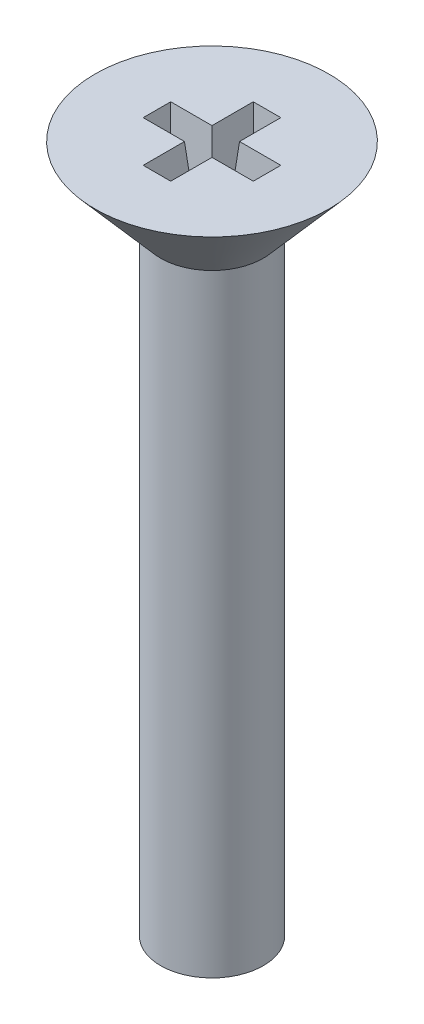
ISO-10303-21;
HEADER;
FILE_DESCRIPTION(('STEP AP214'),'2;1');
FILE_NAME('part.step','',(''),(''),'','','');
FILE_SCHEMA(('AUTOMOTIVE_DESIGN { 1 0 10303 214 1 1 1 1 }'));
ENDSEC;
DATA;
#1=APPLICATION_CONTEXT('core data for automotive mechanical design processes');
#2=APPLICATION_PROTOCOL_DEFINITION('international standard','automotive_design',2000,#1);
#3=PRODUCT_CONTEXT('',#1,'mechanical');
#4=PRODUCT('Part','Part','',(#3));
#5=PRODUCT_RELATED_PRODUCT_CATEGORY('part','',(#4));
#6=PRODUCT_DEFINITION_FORMATION('','',#4);
#7=PRODUCT_DEFINITION_CONTEXT('part definition',#1,'design');
#8=PRODUCT_DEFINITION('design','',#6,#7);
#9=PRODUCT_DEFINITION_SHAPE('','',#8);
#10=(LENGTH_UNIT() NAMED_UNIT(*) SI_UNIT(.MILLI.,.METRE.));
#11=(NAMED_UNIT(*) PLANE_ANGLE_UNIT() SI_UNIT($,.RADIAN.));
#12=(NAMED_UNIT(*) SI_UNIT($,.STERADIAN.) SOLID_ANGLE_UNIT());
#13=UNCERTAINTY_MEASURE_WITH_UNIT(LENGTH_MEASURE(1.E-05),#10,'distance_accuracy_value','');
#14=(GEOMETRIC_REPRESENTATION_CONTEXT(3) GLOBAL_UNCERTAINTY_ASSIGNED_CONTEXT((#13)) GLOBAL_UNIT_ASSIGNED_CONTEXT((#10,
#11,#12)) REPRESENTATION_CONTEXT('',''));
#15=CARTESIAN_POINT('',(0.,0.,0.));
#16=DIRECTION('',(0.,0.,1.));
#17=DIRECTION('',(1.,0.,0.));
#18=AXIS2_PLACEMENT_3D('',#15,#16,#17);
#19=CARTESIAN_POINT('',(0.,-16.9608159356459,0.));
#20=DIRECTION('',(0.,1.,0.));
#21=DIRECTION('',(-1.,0.,0.));
#22=AXIS2_PLACEMENT_3D('',#19,#20,#21);
#23=PLANE('',#22);
#24=CARTESIAN_POINT('',(0.,-16.9608159356459,0.));
#25=DIRECTION('',(0.,1.,0.));
#26=DIRECTION('',(-1.,0.,0.));
#27=AXIS2_PLACEMENT_3D('',#24,#25,#26);
#28=CIRCLE('',#27,1.4224);
#29=CARTESIAN_POINT('',(-1.4224,-16.9608159356459,0.));
#30=VERTEX_POINT('',#29);
#31=EDGE_CURVE('E11',#30,#30,#28,.T.);
#32=ORIENTED_EDGE('',*,*,#31,.F.);
#33=EDGE_LOOP('',(#32));
#34=FACE_BOUND('',#33,.T.);
#35=ADVANCED_FACE('F32',(#34),#23,.F.);
#36=CARTESIAN_POINT('',(0.,0.,0.));
#37=DIRECTION('',(0.,1.,0.));
#38=DIRECTION('',(-1.,0.,0.));
#39=AXIS2_PLACEMENT_3D('',#36,#37,#38);
#40=CYLINDRICAL_SURFACE('',#39,1.4224);
#41=CARTESIAN_POINT('',(0.,0.,0.));
#42=DIRECTION('',(0.,1.,0.));
#43=DIRECTION('',(-1.,0.,0.));
#44=AXIS2_PLACEMENT_3D('',#41,#42,#43);
#45=CIRCLE('',#44,1.4224);
#46=CARTESIAN_POINT('',(-1.4224,0.,0.));
#47=VERTEX_POINT('',#46);
#48=EDGE_CURVE('E39',#47,#47,#45,.T.);
#49=ORIENTED_EDGE('',*,*,#48,.F.);
#50=EDGE_LOOP('',(#49));
#51=FACE_BOUND('',#50,.T.);
#52=ORIENTED_EDGE('',*,*,#31,.T.);
#53=EDGE_LOOP('',(#52));
#54=FACE_BOUND('',#53,.T.);
#55=ADVANCED_FACE('F231',(#51,#54),#40,.T.);
#56=CARTESIAN_POINT('',(0.,0.,0.));
#57=DIRECTION('',(0.,1.,0.));
#58=DIRECTION('',(-1.,0.,0.));
#59=AXIS2_PLACEMENT_3D('',#56,#57,#58);
#60=CONICAL_SURFACE('',#59,1.4224,0.715584993317668);
#61=CARTESIAN_POINT('',(0.,2.0891840643541,0.));
#62=DIRECTION('',(0.,1.,0.));
#63=DIRECTION('',(-1.,0.,0.));
#64=AXIS2_PLACEMENT_3D('',#61,#62,#63);
#65=CIRCLE('',#64,3.23849999999999);
#66=CARTESIAN_POINT('',(-3.23849999999999,2.08918406435409,0.));
#67=VERTEX_POINT('',#66);
#68=EDGE_CURVE('E175',#67,#67,#65,.T.);
#69=ORIENTED_EDGE('',*,*,#68,.F.);
#70=EDGE_LOOP('',(#69));
#71=FACE_BOUND('',#70,.T.);
#72=ORIENTED_EDGE('',*,*,#48,.T.);
#73=EDGE_LOOP('',(#72));
#74=FACE_BOUND('',#73,.T.);
#75=ADVANCED_FACE('F229',(#71,#74),#60,.T.);
#76=CARTESIAN_POINT('',(3.23849999999999,2.0891840643541,0.));
#77=DIRECTION('',(0.,-1.,0.));
#78=DIRECTION('',(1.,0.,0.));
#79=AXIS2_PLACEMENT_3D('',#76,#77,#78);
#80=PLANE('',#79);
#81=DIRECTION('',(-1.,0.,0.));
#82=VECTOR('',#81,1.);
#83=CARTESIAN_POINT('',(-1.524,2.0891840643541,-0.381));
#84=LINE('',#83,#82);
#85=CARTESIAN_POINT('',(-0.381,2.0891840643541,-0.381));
#86=VERTEX_POINT('',#85);
#87=CARTESIAN_POINT('',(-1.524,2.0891840643541,-0.381));
#88=VERTEX_POINT('',#87);
#89=EDGE_CURVE('E138',#86,#88,#84,.T.);
#90=ORIENTED_EDGE('',*,*,#89,.F.);
#91=DIRECTION('',(0.,0.,1.));
#92=VECTOR('',#91,1.);
#93=CARTESIAN_POINT('',(-0.381,2.0891840643541,-0.381));
#94=LINE('',#93,#92);
#95=CARTESIAN_POINT('',(-0.381,2.0891840643541,-1.524));
#96=VERTEX_POINT('',#95);
#97=EDGE_CURVE('E46',#96,#86,#94,.T.);
#98=ORIENTED_EDGE('',*,*,#97,.F.);
#99=DIRECTION('',(-1.,0.,0.));
#100=VECTOR('',#99,1.);
#101=CARTESIAN_POINT('',(-0.381,2.0891840643541,-1.524));
#102=LINE('',#101,#100);
#103=CARTESIAN_POINT('',(0.381,2.0891840643541,-1.524));
#104=VERTEX_POINT('',#103);
#105=EDGE_CURVE('E171',#104,#96,#102,.T.);
#106=ORIENTED_EDGE('',*,*,#105,.F.);
#107=DIRECTION('',(0.,0.,-1.));
#108=VECTOR('',#107,1.);
#109=CARTESIAN_POINT('',(0.381,2.0891840643541,-1.524));
#110=LINE('',#109,#108);
#111=CARTESIAN_POINT('',(0.381,2.0891840643541,-0.381));
#112=VERTEX_POINT('',#111);
#113=EDGE_CURVE('E169',#112,#104,#110,.T.);
#114=ORIENTED_EDGE('',*,*,#113,.F.);
#115=DIRECTION('',(-1.,0.,0.));
#116=VECTOR('',#115,1.);
#117=CARTESIAN_POINT('',(0.381,2.0891840643541,-0.381));
#118=LINE('',#117,#116);
#119=CARTESIAN_POINT('',(1.524,2.0891840643541,-0.381));
#120=VERTEX_POINT('',#119);
#121=EDGE_CURVE('E166',#120,#112,#118,.T.);
#122=ORIENTED_EDGE('',*,*,#121,.F.);
#123=DIRECTION('',(0.,0.,-1.));
#124=VECTOR('',#123,1.);
#125=CARTESIAN_POINT('',(1.524,2.0891840643541,-0.381));
#126=LINE('',#125,#124);
#127=CARTESIAN_POINT('',(1.524,2.0891840643541,0.381));
#128=VERTEX_POINT('',#127);
#129=EDGE_CURVE('E163',#128,#120,#126,.T.);
#130=ORIENTED_EDGE('',*,*,#129,.F.);
#131=DIRECTION('',(1.,0.,0.));
#132=VECTOR('',#131,1.);
#133=CARTESIAN_POINT('',(1.524,2.0891840643541,0.381));
#134=LINE('',#133,#132);
#135=CARTESIAN_POINT('',(0.381,2.0891840643541,0.381));
#136=VERTEX_POINT('',#135);
#137=EDGE_CURVE('E160',#136,#128,#134,.T.);
#138=ORIENTED_EDGE('',*,*,#137,.F.);
#139=DIRECTION('',(0.,0.,-1.));
#140=VECTOR('',#139,1.);
#141=CARTESIAN_POINT('',(0.381,2.0891840643541,0.381));
#142=LINE('',#141,#140);
#143=CARTESIAN_POINT('',(0.381,2.0891840643541,1.524));
#144=VERTEX_POINT('',#143);
#145=EDGE_CURVE('E157',#144,#136,#142,.T.);
#146=ORIENTED_EDGE('',*,*,#145,.F.);
#147=DIRECTION('',(1.,0.,0.));
#148=VECTOR('',#147,1.);
#149=CARTESIAN_POINT('',(0.381,2.0891840643541,1.524));
#150=LINE('',#149,#148);
#151=CARTESIAN_POINT('',(-0.381,2.0891840643541,1.524));
#152=VERTEX_POINT('',#151);
#153=EDGE_CURVE('E154',#152,#144,#150,.T.);
#154=ORIENTED_EDGE('',*,*,#153,.F.);
#155=DIRECTION('',(0.,0.,1.));
#156=VECTOR('',#155,1.);
#157=CARTESIAN_POINT('',(-0.381,2.0891840643541,1.524));
#158=LINE('',#157,#156);
#159=CARTESIAN_POINT('',(-0.381,2.0891840643541,0.381));
#160=VERTEX_POINT('',#159);
#161=EDGE_CURVE('E148',#160,#152,#158,.T.);
#162=ORIENTED_EDGE('',*,*,#161,.F.);
#163=DIRECTION('',(1.,0.,0.));
#164=VECTOR('',#163,1.);
#165=CARTESIAN_POINT('',(-0.381,2.0891840643541,0.381));
#166=LINE('',#165,#164);
#167=CARTESIAN_POINT('',(-1.524,2.0891840643541,0.381));
#168=VERTEX_POINT('',#167);
#169=EDGE_CURVE('E146',#168,#160,#166,.T.);
#170=ORIENTED_EDGE('',*,*,#169,.F.);
#171=DIRECTION('',(0.,0.,1.));
#172=VECTOR('',#171,1.);
#173=CARTESIAN_POINT('',(-1.524,2.0891840643541,0.381));
#174=LINE('',#173,#172);
#175=EDGE_CURVE('E129',#88,#168,#174,.T.);
#176=ORIENTED_EDGE('',*,*,#175,.F.);
#177=EDGE_LOOP('',(#90,#98,#106,#114,#122,#130,#138,#146,#154,#162,#170,#176));
#178=FACE_BOUND('',#177,.T.);
#179=ORIENTED_EDGE('',*,*,#68,.T.);
#180=EDGE_LOOP('',(#179));
#181=FACE_BOUND('',#180,.T.);
#182=ADVANCED_FACE('F142',(#178,#181),#80,.F.);
#183=CARTESIAN_POINT('',(-0.381,2.0891840643541,-0.381));
#184=DIRECTION('',(-0.996194698091746,-0.0871557427476583,0.));
#185=DIRECTION('',(0.0871557427476583,-0.996194698091746,0.));
#186=AXIS2_PLACEMENT_3D('',#183,#184,#185);
#187=PLANE('',#186);
#188=ORIENTED_EDGE('',*,*,#97,.T.);
#189=DIRECTION('',(-0.0868265938642477,0.992432509138967,-0.0868265938642476));
#190=VECTOR('',#189,1.);
#191=CARTESIAN_POINT('',(-0.389616914010563,2.18767584218322,-0.389616914010563));
#192=LINE('',#191,#190);
#193=CARTESIAN_POINT('',(-0.19211197544753,-0.0698159356459045,-0.19211197544753));
#194=VERTEX_POINT('',#193);
#195=EDGE_CURVE('E89',#194,#86,#192,.T.);
#196=ORIENTED_EDGE('',*,*,#195,.F.);
#197=DIRECTION('',(0.,0.,1.));
#198=VECTOR('',#197,1.);
#199=CARTESIAN_POINT('',(-0.19211197544753,-0.0698159356459045,-0.381));
#200=LINE('',#199,#198);
#201=CARTESIAN_POINT('',(-0.19211197544753,-0.0698159356459045,-1.33511197544753));
#202=VERTEX_POINT('',#201);
#203=EDGE_CURVE('E173',#202,#194,#200,.T.);
#204=ORIENTED_EDGE('',*,*,#203,.F.);
#205=DIRECTION('',(-0.0868265938642477,0.992432509138967,-0.0868265938642476));
#206=VECTOR('',#205,1.);
#207=CARTESIAN_POINT('',(-0.381,2.0891840643541,-1.524));
#208=LINE('',#207,#206);
#209=EDGE_CURVE('E54',#202,#96,#208,.T.);
#210=ORIENTED_EDGE('',*,*,#209,.T.);
#211=EDGE_LOOP('',(#188,#196,#204,#210));
#212=FACE_BOUND('',#211,.T.);
#213=ADVANCED_FACE('F256',(#212),#187,.F.);
#214=CARTESIAN_POINT('',(-0.381,2.0891840643541,-1.524));
#215=DIRECTION('',(0.,-0.0871557427476582,-0.996194698091745));
#216=DIRECTION('',(0.,0.996194698091746,-0.0871557427476582));
#217=AXIS2_PLACEMENT_3D('',#214,#215,#216);
#218=PLANE('',#217);
#219=ORIENTED_EDGE('',*,*,#105,.T.);
#220=ORIENTED_EDGE('',*,*,#209,.F.);
#221=DIRECTION('',(-1.,0.,0.));
#222=VECTOR('',#221,1.);
#223=CARTESIAN_POINT('',(-0.381,-0.0698159356459045,-1.33511197544753));
#224=LINE('',#223,#222);
#225=CARTESIAN_POINT('',(0.19211197544753,-0.0698159356459045,-1.33511197544753));
#226=VERTEX_POINT('',#225);
#227=EDGE_CURVE('E176',#226,#202,#224,.T.);
#228=ORIENTED_EDGE('',*,*,#227,.F.);
#229=DIRECTION('',(0.0868265938642475,0.992432509138967,-0.0868265938642476));
#230=VECTOR('',#229,1.);
#231=CARTESIAN_POINT('',(0.381,2.0891840643541,-1.524));
#232=LINE('',#231,#230);
#233=EDGE_CURVE('E94',#226,#104,#232,.T.);
#234=ORIENTED_EDGE('',*,*,#233,.T.);
#235=EDGE_LOOP('',(#219,#220,#228,#234));
#236=FACE_BOUND('',#235,.T.);
#237=ADVANCED_FACE('F263',(#236),#218,.F.);
#238=CARTESIAN_POINT('',(0.381,2.0891840643541,-1.524));
#239=DIRECTION('',(0.996194698091746,-0.0871557427476581,0.));
#240=DIRECTION('',(0.0871557427476581,0.996194698091746,0.));
#241=AXIS2_PLACEMENT_3D('',#238,#239,#240);
#242=PLANE('',#241);
#243=ORIENTED_EDGE('',*,*,#113,.T.);
#244=ORIENTED_EDGE('',*,*,#233,.F.);
#245=DIRECTION('',(0.,0.,-1.));
#246=VECTOR('',#245,1.);
#247=CARTESIAN_POINT('',(0.19211197544753,-0.0698159356459045,-1.524));
#248=LINE('',#247,#246);
#249=CARTESIAN_POINT('',(0.19211197544753,-0.0698159356459045,-0.19211197544753));
#250=VERTEX_POINT('',#249);
#251=EDGE_CURVE('E199',#250,#226,#248,.T.);
#252=ORIENTED_EDGE('',*,*,#251,.F.);
#253=DIRECTION('',(0.0868265938642475,0.992432509138967,-0.0868265938642476));
#254=VECTOR('',#253,1.);
#255=CARTESIAN_POINT('',(0.389616914010563,2.18767584218322,-0.389616914010563));
#256=LINE('',#255,#254);
#257=EDGE_CURVE('E191',#250,#112,#256,.T.);
#258=ORIENTED_EDGE('',*,*,#257,.T.);
#259=EDGE_LOOP('',(#243,#244,#252,#258));
#260=FACE_BOUND('',#259,.T.);
#261=ADVANCED_FACE('F270',(#260),#242,.F.);
#262=CARTESIAN_POINT('',(0.381,2.0891840643541,-0.381));
#263=DIRECTION('',(0.,-0.0871557427476582,-0.996194698091746));
#264=DIRECTION('',(0.,0.996194698091746,-0.0871557427476582));
#265=AXIS2_PLACEMENT_3D('',#262,#263,#264);
#266=PLANE('',#265);
#267=ORIENTED_EDGE('',*,*,#121,.T.);
#268=ORIENTED_EDGE('',*,*,#257,.F.);
#269=DIRECTION('',(-1.,0.,0.));
#270=VECTOR('',#269,1.);
#271=CARTESIAN_POINT('',(0.381,-0.0698159356459045,-0.19211197544753));
#272=LINE('',#271,#270);
#273=CARTESIAN_POINT('',(1.33511197544753,-0.0698159356459045,-0.19211197544753));
#274=VERTEX_POINT('',#273);
#275=EDGE_CURVE('E202',#274,#250,#272,.T.);
#276=ORIENTED_EDGE('',*,*,#275,.F.);
#277=DIRECTION('',(0.0868265938642476,0.992432509138967,-0.0868265938642476));
#278=VECTOR('',#277,1.);
#279=CARTESIAN_POINT('',(1.524,2.0891840643541,-0.381));
#280=LINE('',#279,#278);
#281=EDGE_CURVE('E189',#274,#120,#280,.T.);
#282=ORIENTED_EDGE('',*,*,#281,.T.);
#283=EDGE_LOOP('',(#267,#268,#276,#282));
#284=FACE_BOUND('',#283,.T.);
#285=ADVANCED_FACE('F277',(#284),#266,.F.);
#286=CARTESIAN_POINT('',(1.524,2.0891840643541,-0.381));
#287=DIRECTION('',(0.996194698091745,-0.0871557427476581,0.));
#288=DIRECTION('',(0.0871557427476581,0.996194698091746,0.));
#289=AXIS2_PLACEMENT_3D('',#286,#287,#288);
#290=PLANE('',#289);
#291=ORIENTED_EDGE('',*,*,#129,.T.);
#292=ORIENTED_EDGE('',*,*,#281,.F.);
#293=DIRECTION('',(0.,0.,-1.));
#294=VECTOR('',#293,1.);
#295=CARTESIAN_POINT('',(1.33511197544753,-0.0698159356459045,-0.381));
#296=LINE('',#295,#294);
#297=CARTESIAN_POINT('',(1.33511197544753,-0.0698159356459045,0.19211197544753));
#298=VERTEX_POINT('',#297);
#299=EDGE_CURVE('E205',#298,#274,#296,.T.);
#300=ORIENTED_EDGE('',*,*,#299,.F.);
#301=DIRECTION('',(0.0868265938642476,0.992432509138967,0.0868265938642476));
#302=VECTOR('',#301,1.);
#303=CARTESIAN_POINT('',(1.524,2.0891840643541,0.381));
#304=LINE('',#303,#302);
#305=EDGE_CURVE('E187',#298,#128,#304,.T.);
#306=ORIENTED_EDGE('',*,*,#305,.T.);
#307=EDGE_LOOP('',(#291,#292,#300,#306));
#308=FACE_BOUND('',#307,.T.);
#309=ADVANCED_FACE('F285',(#308),#290,.F.);
#310=CARTESIAN_POINT('',(1.524,2.0891840643541,0.381));
#311=DIRECTION('',(0.,-0.0871557427476582,0.996194698091746));
#312=DIRECTION('',(0.,-0.996194698091746,-0.0871557427476582));
#313=AXIS2_PLACEMENT_3D('',#310,#311,#312);
#314=PLANE('',#313);
#315=ORIENTED_EDGE('',*,*,#137,.T.);
#316=ORIENTED_EDGE('',*,*,#305,.F.);
#317=DIRECTION('',(1.,0.,0.));
#318=VECTOR('',#317,1.);
#319=CARTESIAN_POINT('',(1.524,-0.0698159356459045,0.19211197544753));
#320=LINE('',#319,#318);
#321=CARTESIAN_POINT('',(0.19211197544753,-0.0698159356459045,0.19211197544753));
#322=VERTEX_POINT('',#321);
#323=EDGE_CURVE('E208',#322,#298,#320,.T.);
#324=ORIENTED_EDGE('',*,*,#323,.F.);
#325=DIRECTION('',(0.0868265938642475,0.992432509138967,0.0868265938642476));
#326=VECTOR('',#325,1.);
#327=CARTESIAN_POINT('',(0.389616914010563,2.18767584218322,0.389616914010563));
#328=LINE('',#327,#326);
#329=EDGE_CURVE('E185',#322,#136,#328,.T.);
#330=ORIENTED_EDGE('',*,*,#329,.T.);
#331=EDGE_LOOP('',(#315,#316,#324,#330));
#332=FACE_BOUND('',#331,.T.);
#333=ADVANCED_FACE('F293',(#332),#314,.F.);
#334=CARTESIAN_POINT('',(0.381,2.0891840643541,0.381));
#335=DIRECTION('',(0.996194698091746,-0.0871557427476581,0.));
#336=DIRECTION('',(0.0871557427476581,0.996194698091746,0.));
#337=AXIS2_PLACEMENT_3D('',#334,#335,#336);
#338=PLANE('',#337);
#339=ORIENTED_EDGE('',*,*,#145,.T.);
#340=ORIENTED_EDGE('',*,*,#329,.F.);
#341=DIRECTION('',(0.,0.,-1.));
#342=VECTOR('',#341,1.);
#343=CARTESIAN_POINT('',(0.19211197544753,-0.0698159356459045,0.381));
#344=LINE('',#343,#342);
#345=CARTESIAN_POINT('',(0.19211197544753,-0.0698159356459045,1.33511197544753));
#346=VERTEX_POINT('',#345);
#347=EDGE_CURVE('E211',#346,#322,#344,.T.);
#348=ORIENTED_EDGE('',*,*,#347,.F.);
#349=DIRECTION('',(0.0868265938642475,0.992432509138967,0.0868265938642476));
#350=VECTOR('',#349,1.);
#351=CARTESIAN_POINT('',(0.381,2.0891840643541,1.524));
#352=LINE('',#351,#350);
#353=EDGE_CURVE('E183',#346,#144,#352,.T.);
#354=ORIENTED_EDGE('',*,*,#353,.T.);
#355=EDGE_LOOP('',(#339,#340,#348,#354));
#356=FACE_BOUND('',#355,.T.);
#357=ADVANCED_FACE('F301',(#356),#338,.F.);
#358=CARTESIAN_POINT('',(0.381,2.0891840643541,1.524));
#359=DIRECTION('',(0.,-0.0871557427476582,0.996194698091745));
#360=DIRECTION('',(0.,-0.996194698091746,-0.0871557427476582));
#361=AXIS2_PLACEMENT_3D('',#358,#359,#360);
#362=PLANE('',#361);
#363=ORIENTED_EDGE('',*,*,#153,.T.);
#364=ORIENTED_EDGE('',*,*,#353,.F.);
#365=DIRECTION('',(1.,0.,0.));
#366=VECTOR('',#365,1.);
#367=CARTESIAN_POINT('',(0.381,-0.0698159356459045,1.33511197544753));
#368=LINE('',#367,#366);
#369=CARTESIAN_POINT('',(-0.19211197544753,-0.0698159356459045,1.33511197544753));
#370=VERTEX_POINT('',#369);
#371=EDGE_CURVE('E214',#370,#346,#368,.T.);
#372=ORIENTED_EDGE('',*,*,#371,.F.);
#373=DIRECTION('',(-0.0868265938642477,0.992432509138967,0.0868265938642476));
#374=VECTOR('',#373,1.);
#375=CARTESIAN_POINT('',(-0.381,2.0891840643541,1.524));
#376=LINE('',#375,#374);
#377=EDGE_CURVE('E181',#370,#152,#376,.T.);
#378=ORIENTED_EDGE('',*,*,#377,.T.);
#379=EDGE_LOOP('',(#363,#364,#372,#378));
#380=FACE_BOUND('',#379,.T.);
#381=ADVANCED_FACE('F309',(#380),#362,.F.);
#382=CARTESIAN_POINT('',(-0.381,2.0891840643541,1.524));
#383=DIRECTION('',(-0.996194698091746,-0.0871557427476583,0.));
#384=DIRECTION('',(0.0871557427476583,-0.996194698091746,0.));
#385=AXIS2_PLACEMENT_3D('',#382,#383,#384);
#386=PLANE('',#385);
#387=ORIENTED_EDGE('',*,*,#161,.T.);
#388=ORIENTED_EDGE('',*,*,#377,.F.);
#389=DIRECTION('',(0.,0.,1.));
#390=VECTOR('',#389,1.);
#391=CARTESIAN_POINT('',(-0.19211197544753,-0.0698159356459045,1.524));
#392=LINE('',#391,#390);
#393=CARTESIAN_POINT('',(-0.19211197544753,-0.0698159356459045,0.19211197544753));
#394=VERTEX_POINT('',#393);
#395=EDGE_CURVE('E217',#394,#370,#392,.T.);
#396=ORIENTED_EDGE('',*,*,#395,.F.);
#397=DIRECTION('',(-0.0868265938642477,0.992432509138967,0.0868265938642476));
#398=VECTOR('',#397,1.);
#399=CARTESIAN_POINT('',(-0.389616914010563,2.18767584218322,0.389616914010563));
#400=LINE('',#399,#398);
#401=EDGE_CURVE('E179',#394,#160,#400,.T.);
#402=ORIENTED_EDGE('',*,*,#401,.T.);
#403=EDGE_LOOP('',(#387,#388,#396,#402));
#404=FACE_BOUND('',#403,.T.);
#405=ADVANCED_FACE('F317',(#404),#386,.F.);
#406=CARTESIAN_POINT('',(-0.381,2.0891840643541,0.381));
#407=DIRECTION('',(0.,-0.0871557427476582,0.996194698091746));
#408=DIRECTION('',(0.,-0.996194698091746,-0.0871557427476582));
#409=AXIS2_PLACEMENT_3D('',#406,#407,#408);
#410=PLANE('',#409);
#411=ORIENTED_EDGE('',*,*,#169,.T.);
#412=ORIENTED_EDGE('',*,*,#401,.F.);
#413=DIRECTION('',(1.,0.,0.));
#414=VECTOR('',#413,1.);
#415=CARTESIAN_POINT('',(-0.381,-0.0698159356459045,0.19211197544753));
#416=LINE('',#415,#414);
#417=CARTESIAN_POINT('',(-1.33511197544753,-0.0698159356459045,0.19211197544753));
#418=VERTEX_POINT('',#417);
#419=EDGE_CURVE('E220',#418,#394,#416,.T.);
#420=ORIENTED_EDGE('',*,*,#419,.F.);
#421=DIRECTION('',(-0.0868265938642477,0.992432509138967,0.0868265938642476));
#422=VECTOR('',#421,1.);
#423=CARTESIAN_POINT('',(-1.524,2.0891840643541,0.381));
#424=LINE('',#423,#422);
#425=EDGE_CURVE('E135',#418,#168,#424,.T.);
#426=ORIENTED_EDGE('',*,*,#425,.T.);
#427=EDGE_LOOP('',(#411,#412,#420,#426));
#428=FACE_BOUND('',#427,.T.);
#429=ADVANCED_FACE('F325',(#428),#410,.F.);
#430=CARTESIAN_POINT('',(-1.524,2.0891840643541,0.381));
#431=DIRECTION('',(-0.996194698091745,-0.0871557427476583,0.));
#432=DIRECTION('',(0.0871557427476583,-0.996194698091746,0.));
#433=AXIS2_PLACEMENT_3D('',#430,#431,#432);
#434=PLANE('',#433);
#435=ORIENTED_EDGE('',*,*,#175,.T.);
#436=ORIENTED_EDGE('',*,*,#425,.F.);
#437=DIRECTION('',(0.,0.,1.));
#438=VECTOR('',#437,1.);
#439=CARTESIAN_POINT('',(-1.33511197544753,-0.0698159356459045,0.381));
#440=LINE('',#439,#438);
#441=CARTESIAN_POINT('',(-1.33511197544753,-0.0698159356459045,-0.19211197544753));
#442=VERTEX_POINT('',#441);
#443=EDGE_CURVE('E132',#442,#418,#440,.T.);
#444=ORIENTED_EDGE('',*,*,#443,.F.);
#445=DIRECTION('',(-0.0868265938642477,0.992432509138967,-0.0868265938642476));
#446=VECTOR('',#445,1.);
#447=CARTESIAN_POINT('',(-1.524,2.0891840643541,-0.381));
#448=LINE('',#447,#446);
#449=EDGE_CURVE('E125',#442,#88,#448,.T.);
#450=ORIENTED_EDGE('',*,*,#449,.T.);
#451=EDGE_LOOP('',(#435,#436,#444,#450));
#452=FACE_BOUND('',#451,.T.);
#453=ADVANCED_FACE('F127',(#452),#434,.F.);
#454=CARTESIAN_POINT('',(-1.524,2.0891840643541,-0.381));
#455=DIRECTION('',(0.,-0.0871557427476582,-0.996194698091746));
#456=DIRECTION('',(0.,0.996194698091746,-0.0871557427476582));
#457=AXIS2_PLACEMENT_3D('',#454,#455,#456);
#458=PLANE('',#457);
#459=ORIENTED_EDGE('',*,*,#89,.T.);
#460=ORIENTED_EDGE('',*,*,#449,.F.);
#461=DIRECTION('',(-1.,0.,0.));
#462=VECTOR('',#461,1.);
#463=CARTESIAN_POINT('',(-1.524,-0.0698159356459045,-0.19211197544753));
#464=LINE('',#463,#462);
#465=EDGE_CURVE('E196',#194,#442,#464,.T.);
#466=ORIENTED_EDGE('',*,*,#465,.F.);
#467=ORIENTED_EDGE('',*,*,#195,.T.);
#468=EDGE_LOOP('',(#459,#460,#466,#467));
#469=FACE_BOUND('',#468,.T.);
#470=ADVANCED_FACE('F139',(#469),#458,.F.);
#471=CARTESIAN_POINT('',(0.,-0.0698159356459045,0.));
#472=DIRECTION('',(0.,-1.,0.));
#473=DIRECTION('',(0.,0.,-1.));
#474=AXIS2_PLACEMENT_3D('',#471,#472,#473);
#475=PLANE('',#474);
#476=ORIENTED_EDGE('',*,*,#203,.T.);
#477=ORIENTED_EDGE('',*,*,#465,.T.);
#478=ORIENTED_EDGE('',*,*,#443,.T.);
#479=ORIENTED_EDGE('',*,*,#419,.T.);
#480=ORIENTED_EDGE('',*,*,#395,.T.);
#481=ORIENTED_EDGE('',*,*,#371,.T.);
#482=ORIENTED_EDGE('',*,*,#347,.T.);
#483=ORIENTED_EDGE('',*,*,#323,.T.);
#484=ORIENTED_EDGE('',*,*,#299,.T.);
#485=ORIENTED_EDGE('',*,*,#275,.T.);
#486=ORIENTED_EDGE('',*,*,#251,.T.);
#487=ORIENTED_EDGE('',*,*,#227,.T.);
#488=EDGE_LOOP('',(#476,#477,#478,#479,#480,#481,#482,#483,#484,#485,#486,#487));
#489=FACE_BOUND('',#488,.T.);
#490=ADVANCED_FACE('F346',(#489),#475,.F.);
#491=CLOSED_SHELL('',(#35,#55,#75,#182,#213,#237,#261,#285,#309,#333,#357,#381,#405,#429,#453,
#470,#490));
#492=MANIFOLD_SOLID_BREP('B2',#491);
#493=ADVANCED_BREP_SHAPE_REPRESENTATION('',(#18,#492),#14);
#494=SHAPE_DEFINITION_REPRESENTATION(#9,#493);
ENDSEC;
END-ISO-10303-21;
